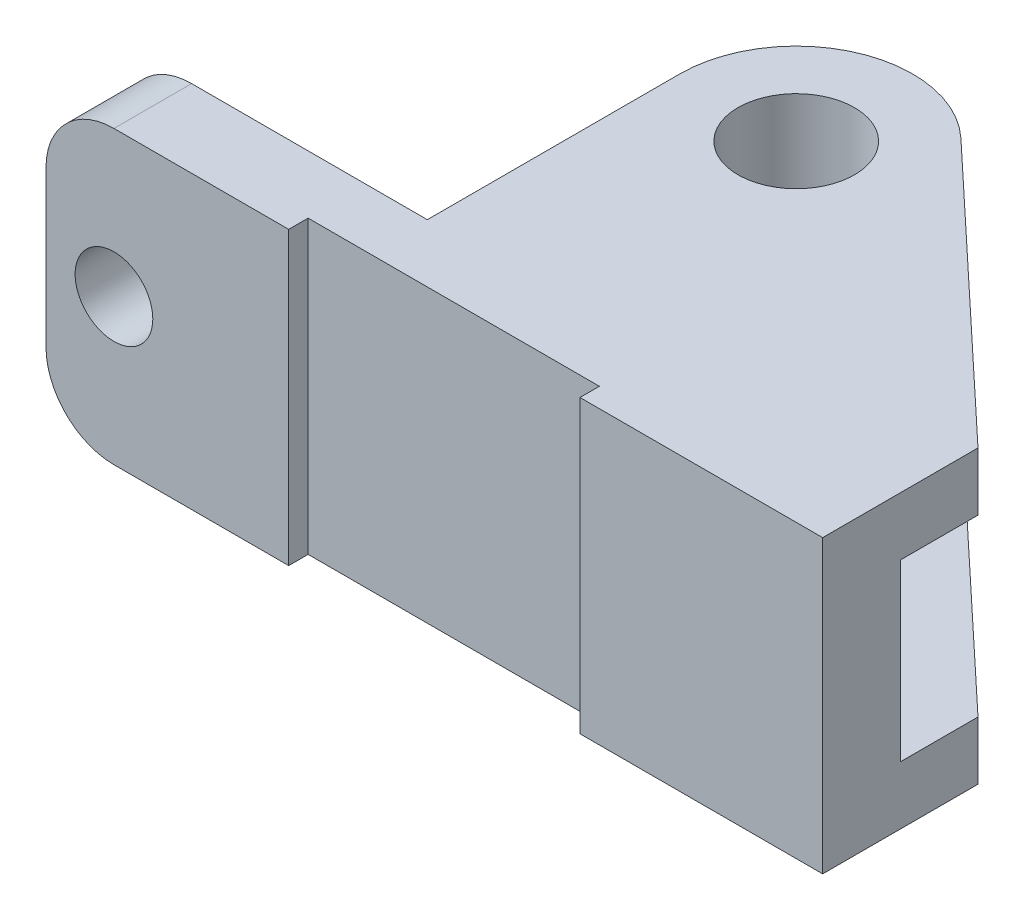
ISO-10303-21;
HEADER;
FILE_DESCRIPTION(('STEP AP214'),'2;1');
FILE_NAME('part.step','',(''),(''),'','','');
FILE_SCHEMA(('AUTOMOTIVE_DESIGN { 1 0 10303 214 1 1 1 1 }'));
ENDSEC;
DATA;
#1=APPLICATION_CONTEXT('core data for automotive mechanical design processes');
#2=APPLICATION_PROTOCOL_DEFINITION('international standard','automotive_design',2000,#1);
#3=PRODUCT_CONTEXT('',#1,'mechanical');
#4=PRODUCT('Part','Part','',(#3));
#5=PRODUCT_RELATED_PRODUCT_CATEGORY('part','',(#4));
#6=PRODUCT_DEFINITION_FORMATION('','',#4);
#7=PRODUCT_DEFINITION_CONTEXT('part definition',#1,'design');
#8=PRODUCT_DEFINITION('design','',#6,#7);
#9=PRODUCT_DEFINITION_SHAPE('','',#8);
#10=(LENGTH_UNIT() NAMED_UNIT(*) SI_UNIT(.MILLI.,.METRE.));
#11=(NAMED_UNIT(*) PLANE_ANGLE_UNIT() SI_UNIT($,.RADIAN.));
#12=(NAMED_UNIT(*) SI_UNIT($,.STERADIAN.) SOLID_ANGLE_UNIT());
#13=UNCERTAINTY_MEASURE_WITH_UNIT(LENGTH_MEASURE(1.E-05),#10,'distance_accuracy_value','');
#14=(GEOMETRIC_REPRESENTATION_CONTEXT(3) GLOBAL_UNCERTAINTY_ASSIGNED_CONTEXT((#13)) GLOBAL_UNIT_ASSIGNED_CONTEXT((#10,
#11,#12)) REPRESENTATION_CONTEXT('',''));
#15=CARTESIAN_POINT('',(0.,0.,0.));
#16=DIRECTION('',(0.,0.,1.));
#17=DIRECTION('',(1.,0.,0.));
#18=AXIS2_PLACEMENT_3D('',#15,#16,#17);
#19=CARTESIAN_POINT('',(-33.,8.,8.));
#20=DIRECTION('',(0.,0.,-1.));
#21=DIRECTION('',(-1.,0.,0.));
#22=AXIS2_PLACEMENT_3D('',#19,#20,#21);
#23=PLANE('',#22);
#24=CARTESIAN_POINT('',(-33.,0.,8.));
#25=DIRECTION('',(0.,0.,1.));
#26=DIRECTION('',(1.,0.,0.));
#27=AXIS2_PLACEMENT_3D('',#24,#25,#26);
#28=CIRCLE('',#27,4.);
#29=CARTESIAN_POINT('',(-29.,0.,8.));
#30=VERTEX_POINT('',#29);
#31=EDGE_CURVE('E242',#30,#30,#28,.T.);
#32=ORIENTED_EDGE('',*,*,#31,.F.);
#33=EDGE_LOOP('',(#32));
#34=FACE_BOUND('',#33,.T.);
#35=DIRECTION('',(1.,0.,0.));
#36=VECTOR('',#35,1.);
#37=CARTESIAN_POINT('',(-33.,-15.,8.));
#38=LINE('',#37,#36);
#39=CARTESIAN_POINT('',(-33.,-15.,8.));
#40=VERTEX_POINT('',#39);
#41=CARTESIAN_POINT('',(-15.,-15.,8.));
#42=VERTEX_POINT('',#41);
#43=EDGE_CURVE('E183',#40,#42,#38,.T.);
#44=ORIENTED_EDGE('',*,*,#43,.T.);
#45=DIRECTION('',(0.,1.,0.));
#46=VECTOR('',#45,1.);
#47=CARTESIAN_POINT('',(-15.,-15.,8.));
#48=LINE('',#47,#46);
#49=CARTESIAN_POINT('',(-15.,15.,8.));
#50=VERTEX_POINT('',#49);
#51=EDGE_CURVE('E166',#42,#50,#48,.T.);
#52=ORIENTED_EDGE('',*,*,#51,.T.);
#53=DIRECTION('',(-1.,0.,0.));
#54=VECTOR('',#53,1.);
#55=CARTESIAN_POINT('',(-33.,15.,8.));
#56=LINE('',#55,#54);
#57=CARTESIAN_POINT('',(-33.,15.,8.));
#58=VERTEX_POINT('',#57);
#59=EDGE_CURVE('E268',#50,#58,#56,.T.);
#60=ORIENTED_EDGE('',*,*,#59,.T.);
#61=CARTESIAN_POINT('',(-33.,8.,8.));
#62=DIRECTION('',(0.,0.,1.));
#63=DIRECTION('',(-1.,0.,0.));
#64=AXIS2_PLACEMENT_3D('',#61,#62,#63);
#65=CIRCLE('',#64,7.);
#66=CARTESIAN_POINT('',(-40.,8.,8.));
#67=VERTEX_POINT('',#66);
#68=EDGE_CURVE('E270',#58,#67,#65,.T.);
#69=ORIENTED_EDGE('',*,*,#68,.T.);
#70=DIRECTION('',(0.,-1.,0.));
#71=VECTOR('',#70,1.);
#72=CARTESIAN_POINT('',(-40.,-8.,8.));
#73=LINE('',#72,#71);
#74=CARTESIAN_POINT('',(-40.,-8.,8.));
#75=VERTEX_POINT('',#74);
#76=EDGE_CURVE('E271',#67,#75,#73,.T.);
#77=ORIENTED_EDGE('',*,*,#76,.T.);
#78=CARTESIAN_POINT('',(-33.,-8.,8.));
#79=DIRECTION('',(0.,0.,1.));
#80=DIRECTION('',(-1.,0.,0.));
#81=AXIS2_PLACEMENT_3D('',#78,#79,#80);
#82=CIRCLE('',#81,7.);
#83=EDGE_CURVE('E188',#75,#40,#82,.T.);
#84=ORIENTED_EDGE('',*,*,#83,.T.);
#85=EDGE_LOOP('',(#44,#52,#60,#69,#77,#84));
#86=FACE_BOUND('',#85,.T.);
#87=ADVANCED_FACE('F41',(#34,#86),#23,.F.);
#88=CARTESIAN_POINT('',(-33.,8.,0.));
#89=DIRECTION('',(0.,0.,-1.));
#90=DIRECTION('',(-1.,0.,0.));
#91=AXIS2_PLACEMENT_3D('',#88,#89,#90);
#92=PLANE('',#91);
#93=CARTESIAN_POINT('',(-33.,0.,0.));
#94=DIRECTION('',(0.,0.,1.));
#95=DIRECTION('',(1.,0.,0.));
#96=AXIS2_PLACEMENT_3D('',#93,#94,#95);
#97=CIRCLE('',#96,4.);
#98=CARTESIAN_POINT('',(-29.,0.,0.));
#99=VERTEX_POINT('',#98);
#100=EDGE_CURVE('E200',#99,#99,#97,.T.);
#101=ORIENTED_EDGE('',*,*,#100,.T.);
#102=EDGE_LOOP('',(#101));
#103=FACE_BOUND('',#102,.T.);
#104=DIRECTION('',(-1.,0.,0.));
#105=VECTOR('',#104,1.);
#106=CARTESIAN_POINT('',(0.,-9.,0.));
#107=LINE('',#106,#105);
#108=CARTESIAN_POINT('',(40.,-9.,0.));
#109=VERTEX_POINT('',#108);
#110=CARTESIAN_POINT('',(-8.72284668201484,-9.,0.));
#111=VERTEX_POINT('',#110);
#112=EDGE_CURVE('E291',#109,#111,#107,.T.);
#113=ORIENTED_EDGE('',*,*,#112,.T.);
#114=DIRECTION('',(0.,-1.,0.));
#115=VECTOR('',#114,1.);
#116=CARTESIAN_POINT('',(-8.72284668201484,-9.,0.));
#117=LINE('',#116,#115);
#118=CARTESIAN_POINT('',(-8.72284668201484,-15.,0.));
#119=VERTEX_POINT('',#118);
#120=EDGE_CURVE('E288',#111,#119,#117,.T.);
#121=ORIENTED_EDGE('',*,*,#120,.T.);
#122=DIRECTION('',(1.,0.,0.));
#123=VECTOR('',#122,1.);
#124=CARTESIAN_POINT('',(-33.,-15.,0.));
#125=LINE('',#124,#123);
#126=CARTESIAN_POINT('',(-33.,-15.,0.));
#127=VERTEX_POINT('',#126);
#128=EDGE_CURVE('E208',#127,#119,#125,.T.);
#129=ORIENTED_EDGE('',*,*,#128,.F.);
#130=CARTESIAN_POINT('',(-33.,-8.,0.));
#131=DIRECTION('',(0.,0.,1.));
#132=DIRECTION('',(-1.,0.,0.));
#133=AXIS2_PLACEMENT_3D('',#130,#131,#132);
#134=CIRCLE('',#133,7.);
#135=CARTESIAN_POINT('',(-40.,-8.,0.));
#136=VERTEX_POINT('',#135);
#137=EDGE_CURVE('E206',#136,#127,#134,.T.);
#138=ORIENTED_EDGE('',*,*,#137,.F.);
#139=DIRECTION('',(0.,-1.,0.));
#140=VECTOR('',#139,1.);
#141=CARTESIAN_POINT('',(-40.,-8.,0.));
#142=LINE('',#141,#140);
#143=CARTESIAN_POINT('',(-40.,8.,0.));
#144=VERTEX_POINT('',#143);
#145=EDGE_CURVE('E204',#144,#136,#142,.T.);
#146=ORIENTED_EDGE('',*,*,#145,.F.);
#147=CARTESIAN_POINT('',(-33.,8.,0.));
#148=DIRECTION('',(0.,0.,1.));
#149=DIRECTION('',(-1.,0.,0.));
#150=AXIS2_PLACEMENT_3D('',#147,#148,#149);
#151=CIRCLE('',#150,7.);
#152=CARTESIAN_POINT('',(-33.,15.,0.));
#153=VERTEX_POINT('',#152);
#154=EDGE_CURVE('E202',#153,#144,#151,.T.);
#155=ORIENTED_EDGE('',*,*,#154,.F.);
#156=DIRECTION('',(-1.,0.,0.));
#157=VECTOR('',#156,1.);
#158=CARTESIAN_POINT('',(-33.,15.,0.));
#159=LINE('',#158,#157);
#160=CARTESIAN_POINT('',(-8.72284668201484,15.,0.));
#161=VERTEX_POINT('',#160);
#162=EDGE_CURVE('E64',#161,#153,#159,.T.);
#163=ORIENTED_EDGE('',*,*,#162,.F.);
#164=DIRECTION('',(0.,1.,0.));
#165=VECTOR('',#164,1.);
#166=CARTESIAN_POINT('',(-8.72284668201484,9.,0.));
#167=LINE('',#166,#165);
#168=CARTESIAN_POINT('',(-8.72284668201484,9.,0.));
#169=VERTEX_POINT('',#168);
#170=EDGE_CURVE('E243',#169,#161,#167,.T.);
#171=ORIENTED_EDGE('',*,*,#170,.F.);
#172=DIRECTION('',(-1.,0.,0.));
#173=VECTOR('',#172,1.);
#174=CARTESIAN_POINT('',(0.,9.,0.));
#175=LINE('',#174,#173);
#176=CARTESIAN_POINT('',(40.,9.,0.));
#177=VERTEX_POINT('',#176);
#178=EDGE_CURVE('E305',#177,#169,#175,.T.);
#179=ORIENTED_EDGE('',*,*,#178,.F.);
#180=DIRECTION('',(0.,1.,0.));
#181=VECTOR('',#180,1.);
#182=CARTESIAN_POINT('',(40.,-15.,0.));
#183=LINE('',#182,#181);
#184=EDGE_CURVE('E198',#109,#177,#183,.T.);
#185=ORIENTED_EDGE('',*,*,#184,.F.);
#186=EDGE_LOOP('',(#113,#121,#129,#138,#146,#155,#163,#171,#179,#185));
#187=FACE_BOUND('',#186,.T.);
#188=ADVANCED_FACE('F286',(#103,#187),#92,.T.);
#189=CARTESIAN_POINT('',(40.,-15.,8.));
#190=DIRECTION('',(-1.,0.,0.));
#191=DIRECTION('',(0.,0.,1.));
#192=AXIS2_PLACEMENT_3D('',#189,#190,#191);
#193=PLANE('',#192);
#194=DIRECTION('',(0.,0.,-1.));
#195=VECTOR('',#194,1.);
#196=CARTESIAN_POINT('',(40.,-15.,8.));
#197=LINE('',#196,#195);
#198=CARTESIAN_POINT('',(40.,-15.,8.));
#199=VERTEX_POINT('',#198);
#200=CARTESIAN_POINT('',(40.,-15.,-8.));
#201=VERTEX_POINT('',#200);
#202=EDGE_CURVE('E190',#199,#201,#197,.T.);
#203=ORIENTED_EDGE('',*,*,#202,.T.);
#204=DIRECTION('',(0.,-1.,0.));
#205=VECTOR('',#204,1.);
#206=CARTESIAN_POINT('',(40.,-9.,-8.));
#207=LINE('',#206,#205);
#208=CARTESIAN_POINT('',(40.,-9.,-8.));
#209=VERTEX_POINT('',#208);
#210=EDGE_CURVE('E294',#209,#201,#207,.T.);
#211=ORIENTED_EDGE('',*,*,#210,.F.);
#212=DIRECTION('',(0.,0.,-1.));
#213=VECTOR('',#212,1.);
#214=CARTESIAN_POINT('',(40.,-9.,0.));
#215=LINE('',#214,#213);
#216=EDGE_CURVE('E335',#109,#209,#215,.T.);
#217=ORIENTED_EDGE('',*,*,#216,.F.);
#218=ORIENTED_EDGE('',*,*,#184,.T.);
#219=DIRECTION('',(0.,0.,-1.));
#220=VECTOR('',#219,1.);
#221=CARTESIAN_POINT('',(40.,9.,0.));
#222=LINE('',#221,#220);
#223=CARTESIAN_POINT('',(40.,9.,-8.));
#224=VERTEX_POINT('',#223);
#225=EDGE_CURVE('E238',#177,#224,#222,.T.);
#226=ORIENTED_EDGE('',*,*,#225,.T.);
#227=DIRECTION('',(0.,1.,0.));
#228=VECTOR('',#227,1.);
#229=CARTESIAN_POINT('',(40.,9.,-8.));
#230=LINE('',#229,#228);
#231=CARTESIAN_POINT('',(40.,15.,-8.));
#232=VERTEX_POINT('',#231);
#233=EDGE_CURVE('E236',#224,#232,#230,.T.);
#234=ORIENTED_EDGE('',*,*,#233,.T.);
#235=DIRECTION('',(0.,0.,-1.));
#236=VECTOR('',#235,1.);
#237=CARTESIAN_POINT('',(40.,15.,8.));
#238=LINE('',#237,#236);
#239=CARTESIAN_POINT('',(40.,15.,8.));
#240=VERTEX_POINT('',#239);
#241=EDGE_CURVE('E49',#240,#232,#238,.T.);
#242=ORIENTED_EDGE('',*,*,#241,.F.);
#243=DIRECTION('',(0.,1.,0.));
#244=VECTOR('',#243,1.);
#245=CARTESIAN_POINT('',(40.,-15.,8.));
#246=LINE('',#245,#244);
#247=EDGE_CURVE('E210',#199,#240,#246,.T.);
#248=ORIENTED_EDGE('',*,*,#247,.F.);
#249=EDGE_LOOP('',(#203,#211,#217,#218,#226,#234,#242,#248));
#250=FACE_BOUND('',#249,.T.);
#251=ADVANCED_FACE('F43',(#250),#193,.F.);
#252=CARTESIAN_POINT('',(-33.,15.,8.));
#253=DIRECTION('',(0.,-1.,0.));
#254=DIRECTION('',(1.,0.,0.));
#255=AXIS2_PLACEMENT_3D('',#252,#253,#254);
#256=PLANE('',#255);
#257=CARTESIAN_POINT('',(3.27715331798516,15.,-26.));
#258=DIRECTION('',(0.,1.,0.));
#259=DIRECTION('',(-1.,0.,0.));
#260=AXIS2_PLACEMENT_3D('',#257,#258,#259);
#261=CIRCLE('',#260,6.);
#262=CARTESIAN_POINT('',(-2.72284668201484,15.,-26.));
#263=VERTEX_POINT('',#262);
#264=EDGE_CURVE('E326',#263,#263,#261,.T.);
#265=ORIENTED_EDGE('',*,*,#264,.F.);
#266=EDGE_LOOP('',(#265));
#267=FACE_BOUND('',#266,.T.);
#268=ORIENTED_EDGE('',*,*,#59,.F.);
#269=DIRECTION('',(0.,0.,1.));
#270=VECTOR('',#269,1.);
#271=CARTESIAN_POINT('',(-15.,15.,8.));
#272=LINE('',#271,#270);
#273=CARTESIAN_POINT('',(-15.,15.,6.));
#274=VERTEX_POINT('',#273);
#275=EDGE_CURVE('E172',#274,#50,#272,.T.);
#276=ORIENTED_EDGE('',*,*,#275,.F.);
#277=DIRECTION('',(-1.,0.,0.));
#278=VECTOR('',#277,1.);
#279=CARTESIAN_POINT('',(-15.,15.,6.));
#280=LINE('',#279,#278);
#281=CARTESIAN_POINT('',(15.,15.,6.));
#282=VERTEX_POINT('',#281);
#283=EDGE_CURVE('E185',#282,#274,#280,.T.);
#284=ORIENTED_EDGE('',*,*,#283,.F.);
#285=DIRECTION('',(0.,0.,-1.));
#286=VECTOR('',#285,1.);
#287=CARTESIAN_POINT('',(15.,15.,8.));
#288=LINE('',#287,#286);
#289=CARTESIAN_POINT('',(15.,15.,8.));
#290=VERTEX_POINT('',#289);
#291=EDGE_CURVE('E366',#290,#282,#288,.T.);
#292=ORIENTED_EDGE('',*,*,#291,.F.);
#293=EDGE_CURVE('E231',#240,#290,#56,.T.);
#294=ORIENTED_EDGE('',*,*,#293,.F.);
#295=ORIENTED_EDGE('',*,*,#241,.T.);
#296=DIRECTION('',(-0.729267686089805,0.,-0.684228501324829));
#297=VECTOR('',#296,1.);
#298=CARTESIAN_POINT('',(22.7186315683517,15.,-24.2140803005124));
#299=LINE('',#298,#297);
#300=CARTESIAN_POINT('',(11.4878953338831,15.,-34.7512122330777));
#301=VERTEX_POINT('',#300);
#302=EDGE_CURVE('E228',#232,#301,#299,.T.);
#303=ORIENTED_EDGE('',*,*,#302,.T.);
#304=CARTESIAN_POINT('',(3.27715331798516,15.,-26.));
#305=DIRECTION('',(0.,1.,0.));
#306=DIRECTION('',(-1.,0.,0.));
#307=AXIS2_PLACEMENT_3D('',#304,#305,#306);
#308=CIRCLE('',#307,12.);
#309=CARTESIAN_POINT('',(-8.72284668201485,15.,-26.));
#310=VERTEX_POINT('',#309);
#311=EDGE_CURVE('E319',#301,#310,#308,.T.);
#312=ORIENTED_EDGE('',*,*,#311,.T.);
#313=DIRECTION('',(0.,0.,1.));
#314=VECTOR('',#313,1.);
#315=CARTESIAN_POINT('',(-8.72284668201484,15.,0.));
#316=LINE('',#315,#314);
#317=EDGE_CURVE('E248',#310,#161,#316,.T.);
#318=ORIENTED_EDGE('',*,*,#317,.T.);
#319=ORIENTED_EDGE('',*,*,#162,.T.);
#320=DIRECTION('',(0.,0.,-1.));
#321=VECTOR('',#320,1.);
#322=CARTESIAN_POINT('',(-33.,15.,8.));
#323=LINE('',#322,#321);
#324=EDGE_CURVE('E219',#58,#153,#323,.T.);
#325=ORIENTED_EDGE('',*,*,#324,.F.);
#326=EDGE_LOOP('',(#268,#276,#284,#292,#294,#295,#303,#312,#318,#319,#325));
#327=FACE_BOUND('',#326,.T.);
#328=ADVANCED_FACE('F225',(#267,#327),#256,.F.);
#329=CARTESIAN_POINT('',(-33.,8.,8.));
#330=DIRECTION('',(0.,0.,-1.));
#331=DIRECTION('',(-1.,0.,0.));
#332=AXIS2_PLACEMENT_3D('',#329,#330,#331);
#333=CYLINDRICAL_SURFACE('',#332,7.);
#334=ORIENTED_EDGE('',*,*,#154,.T.);
#335=DIRECTION('',(0.,0.,-1.));
#336=VECTOR('',#335,1.);
#337=CARTESIAN_POINT('',(-40.,8.,8.));
#338=LINE('',#337,#336);
#339=EDGE_CURVE('E216',#67,#144,#338,.T.);
#340=ORIENTED_EDGE('',*,*,#339,.F.);
#341=ORIENTED_EDGE('',*,*,#68,.F.);
#342=ORIENTED_EDGE('',*,*,#324,.T.);
#343=EDGE_LOOP('',(#334,#340,#341,#342));
#344=FACE_BOUND('',#343,.T.);
#345=ADVANCED_FACE('F411',(#344),#333,.T.);
#346=CARTESIAN_POINT('',(-40.,-8.,8.));
#347=DIRECTION('',(1.,0.,0.));
#348=DIRECTION('',(0.,1.,0.));
#349=AXIS2_PLACEMENT_3D('',#346,#347,#348);
#350=PLANE('',#349);
#351=ORIENTED_EDGE('',*,*,#145,.T.);
#352=DIRECTION('',(0.,0.,-1.));
#353=VECTOR('',#352,1.);
#354=CARTESIAN_POINT('',(-40.,-8.,8.));
#355=LINE('',#354,#353);
#356=EDGE_CURVE('E213',#75,#136,#355,.T.);
#357=ORIENTED_EDGE('',*,*,#356,.F.);
#358=ORIENTED_EDGE('',*,*,#76,.F.);
#359=ORIENTED_EDGE('',*,*,#339,.T.);
#360=EDGE_LOOP('',(#351,#357,#358,#359));
#361=FACE_BOUND('',#360,.T.);
#362=ADVANCED_FACE('F277',(#361),#350,.F.);
#363=CARTESIAN_POINT('',(-33.,-8.,8.));
#364=DIRECTION('',(0.,0.,-1.));
#365=DIRECTION('',(-1.,0.,0.));
#366=AXIS2_PLACEMENT_3D('',#363,#364,#365);
#367=CYLINDRICAL_SURFACE('',#366,7.);
#368=ORIENTED_EDGE('',*,*,#137,.T.);
#369=DIRECTION('',(0.,0.,-1.));
#370=VECTOR('',#369,1.);
#371=CARTESIAN_POINT('',(-33.,-15.,8.));
#372=LINE('',#371,#370);
#373=EDGE_CURVE('E193',#40,#127,#372,.T.);
#374=ORIENTED_EDGE('',*,*,#373,.F.);
#375=ORIENTED_EDGE('',*,*,#83,.F.);
#376=ORIENTED_EDGE('',*,*,#356,.T.);
#377=EDGE_LOOP('',(#368,#374,#375,#376));
#378=FACE_BOUND('',#377,.T.);
#379=ADVANCED_FACE('F281',(#378),#367,.T.);
#380=CARTESIAN_POINT('',(-33.,-15.,8.));
#381=DIRECTION('',(0.,1.,0.));
#382=DIRECTION('',(-1.,0.,0.));
#383=AXIS2_PLACEMENT_3D('',#380,#381,#382);
#384=PLANE('',#383);
#385=CARTESIAN_POINT('',(3.27715331798516,-15.,-26.));
#386=DIRECTION('',(0.,1.,0.));
#387=DIRECTION('',(-1.,0.,0.));
#388=AXIS2_PLACEMENT_3D('',#385,#386,#387);
#389=CIRCLE('',#388,6.);
#390=CARTESIAN_POINT('',(-2.72284668201485,-15.,-26.));
#391=VERTEX_POINT('',#390);
#392=EDGE_CURVE('E322',#391,#391,#389,.T.);
#393=ORIENTED_EDGE('',*,*,#392,.T.);
#394=EDGE_LOOP('',(#393));
#395=FACE_BOUND('',#394,.T.);
#396=DIRECTION('',(-1.,0.,0.));
#397=VECTOR('',#396,1.);
#398=CARTESIAN_POINT('',(-15.,-15.,6.));
#399=LINE('',#398,#397);
#400=CARTESIAN_POINT('',(15.,-15.,6.));
#401=VERTEX_POINT('',#400);
#402=CARTESIAN_POINT('',(-15.,-15.,6.));
#403=VERTEX_POINT('',#402);
#404=EDGE_CURVE('E177',#401,#403,#399,.T.);
#405=ORIENTED_EDGE('',*,*,#404,.T.);
#406=DIRECTION('',(0.,0.,1.));
#407=VECTOR('',#406,1.);
#408=CARTESIAN_POINT('',(-15.,-15.,8.));
#409=LINE('',#408,#407);
#410=EDGE_CURVE('E169',#403,#42,#409,.T.);
#411=ORIENTED_EDGE('',*,*,#410,.T.);
#412=ORIENTED_EDGE('',*,*,#43,.F.);
#413=ORIENTED_EDGE('',*,*,#373,.T.);
#414=ORIENTED_EDGE('',*,*,#128,.T.);
#415=DIRECTION('',(0.,0.,1.));
#416=VECTOR('',#415,1.);
#417=CARTESIAN_POINT('',(-8.72284668201484,-15.,0.));
#418=LINE('',#417,#416);
#419=CARTESIAN_POINT('',(-8.72284668201484,-15.,-26.));
#420=VERTEX_POINT('',#419);
#421=EDGE_CURVE('E336',#420,#119,#418,.T.);
#422=ORIENTED_EDGE('',*,*,#421,.F.);
#423=CARTESIAN_POINT('',(3.27715331798516,-15.,-26.));
#424=DIRECTION('',(0.,1.,0.));
#425=DIRECTION('',(-1.,0.,0.));
#426=AXIS2_PLACEMENT_3D('',#423,#424,#425);
#427=CIRCLE('',#426,12.);
#428=CARTESIAN_POINT('',(11.4878953338831,-15.,-34.7512122330777));
#429=VERTEX_POINT('',#428);
#430=EDGE_CURVE('E321',#429,#420,#427,.T.);
#431=ORIENTED_EDGE('',*,*,#430,.F.);
#432=DIRECTION('',(-0.729267686089805,0.,-0.684228501324829));
#433=VECTOR('',#432,1.);
#434=CARTESIAN_POINT('',(22.7186315683517,-15.,-24.2140803005124));
#435=LINE('',#434,#433);
#436=EDGE_CURVE('E331',#201,#429,#435,.T.);
#437=ORIENTED_EDGE('',*,*,#436,.F.);
#438=ORIENTED_EDGE('',*,*,#202,.F.);
#439=CARTESIAN_POINT('',(15.,-15.,8.));
#440=VERTEX_POINT('',#439);
#441=EDGE_CURVE('E191',#440,#199,#38,.T.);
#442=ORIENTED_EDGE('',*,*,#441,.F.);
#443=DIRECTION('',(0.,0.,-1.));
#444=VECTOR('',#443,1.);
#445=CARTESIAN_POINT('',(15.,-15.,8.));
#446=LINE('',#445,#444);
#447=EDGE_CURVE('E56',#440,#401,#446,.T.);
#448=ORIENTED_EDGE('',*,*,#447,.T.);
#449=EDGE_LOOP('',(#405,#411,#412,#413,#414,#422,#431,#437,#438,#442,#448));
#450=FACE_BOUND('',#449,.T.);
#451=ADVANCED_FACE('F181',(#395,#450),#384,.F.);
#452=ORIENTED_EDGE('',*,*,#293,.T.);
#453=DIRECTION('',(0.,1.,0.));
#454=VECTOR('',#453,1.);
#455=CARTESIAN_POINT('',(15.,-15.,8.));
#456=LINE('',#455,#454);
#457=EDGE_CURVE('E176',#440,#290,#456,.T.);
#458=ORIENTED_EDGE('',*,*,#457,.F.);
#459=ORIENTED_EDGE('',*,*,#441,.T.);
#460=ORIENTED_EDGE('',*,*,#247,.T.);
#461=EDGE_LOOP('',(#452,#458,#459,#460));
#462=FACE_BOUND('',#461,.T.);
#463=ADVANCED_FACE('F353',(#462),#23,.F.);
#464=CARTESIAN_POINT('',(-33.,0.,0.));
#465=DIRECTION('',(0.,0.,1.));
#466=DIRECTION('',(1.,0.,0.));
#467=AXIS2_PLACEMENT_3D('',#464,#465,#466);
#468=CYLINDRICAL_SURFACE('',#467,4.);
#469=ORIENTED_EDGE('',*,*,#100,.F.);
#470=EDGE_LOOP('',(#469));
#471=FACE_BOUND('',#470,.T.);
#472=ORIENTED_EDGE('',*,*,#31,.T.);
#473=EDGE_LOOP('',(#472));
#474=FACE_BOUND('',#473,.T.);
#475=ADVANCED_FACE('F396',(#471,#474),#468,.F.);
#476=CARTESIAN_POINT('',(22.7186315683517,9.,-24.2140803005124));
#477=DIRECTION('',(0.684228501324829,0.,-0.729267686089805));
#478=DIRECTION('',(-0.729267686089805,0.,-0.684228501324829));
#479=AXIS2_PLACEMENT_3D('',#476,#477,#478);
#480=PLANE('',#479);
#481=ORIENTED_EDGE('',*,*,#302,.F.);
#482=ORIENTED_EDGE('',*,*,#233,.F.);
#483=DIRECTION('',(-0.729267686089805,0.,-0.684228501324829));
#484=VECTOR('',#483,1.);
#485=CARTESIAN_POINT('',(22.7186315683517,9.,-24.2140803005124));
#486=LINE('',#485,#484);
#487=CARTESIAN_POINT('',(11.4878953338831,9.,-34.7512122330777));
#488=VERTEX_POINT('',#487);
#489=EDGE_CURVE('E252',#224,#488,#486,.T.);
#490=ORIENTED_EDGE('',*,*,#489,.T.);
#491=DIRECTION('',(0.,1.,0.));
#492=VECTOR('',#491,1.);
#493=CARTESIAN_POINT('',(11.4878953338831,9.,-34.7512122330777));
#494=LINE('',#493,#492);
#495=EDGE_CURVE('E247',#488,#301,#494,.T.);
#496=ORIENTED_EDGE('',*,*,#495,.T.);
#497=EDGE_LOOP('',(#481,#482,#490,#496));
#498=FACE_BOUND('',#497,.T.);
#499=ADVANCED_FACE('F246',(#498),#480,.T.);
#500=CARTESIAN_POINT('',(-8.72284668201484,9.,0.));
#501=DIRECTION('',(-1.,0.,0.));
#502=DIRECTION('',(0.,0.,1.));
#503=AXIS2_PLACEMENT_3D('',#500,#501,#502);
#504=PLANE('',#503);
#505=ORIENTED_EDGE('',*,*,#317,.F.);
#506=DIRECTION('',(0.,1.,0.));
#507=VECTOR('',#506,1.);
#508=CARTESIAN_POINT('',(-8.72284668201484,9.,-26.));
#509=LINE('',#508,#507);
#510=CARTESIAN_POINT('',(-8.72284668201484,9.,-26.));
#511=VERTEX_POINT('',#510);
#512=EDGE_CURVE('E260',#511,#310,#509,.T.);
#513=ORIENTED_EDGE('',*,*,#512,.F.);
#514=DIRECTION('',(0.,0.,1.));
#515=VECTOR('',#514,1.);
#516=CARTESIAN_POINT('',(-8.72284668201484,9.,0.));
#517=LINE('',#516,#515);
#518=EDGE_CURVE('E303',#511,#169,#517,.T.);
#519=ORIENTED_EDGE('',*,*,#518,.T.);
#520=ORIENTED_EDGE('',*,*,#170,.T.);
#521=EDGE_LOOP('',(#505,#513,#519,#520));
#522=FACE_BOUND('',#521,.T.);
#523=ADVANCED_FACE('F315',(#522),#504,.T.);
#524=CARTESIAN_POINT('',(0.,9.,0.));
#525=DIRECTION('',(0.,1.,0.));
#526=DIRECTION('',(-1.,0.,0.));
#527=AXIS2_PLACEMENT_3D('',#524,#525,#526);
#528=PLANE('',#527);
#529=ORIENTED_EDGE('',*,*,#518,.F.);
#530=CARTESIAN_POINT('',(3.27715331798516,9.,-26.));
#531=DIRECTION('',(0.,1.,0.));
#532=DIRECTION('',(-1.,0.,0.));
#533=AXIS2_PLACEMENT_3D('',#530,#531,#532);
#534=CIRCLE('',#533,12.);
#535=EDGE_CURVE('E320',#511,#488,#534,.T.);
#536=ORIENTED_EDGE('',*,*,#535,.T.);
#537=ORIENTED_EDGE('',*,*,#489,.F.);
#538=ORIENTED_EDGE('',*,*,#225,.F.);
#539=ORIENTED_EDGE('',*,*,#178,.T.);
#540=EDGE_LOOP('',(#529,#536,#537,#538,#539));
#541=FACE_BOUND('',#540,.T.);
#542=ADVANCED_FACE('F310',(#541),#528,.F.);
#543=CARTESIAN_POINT('',(22.7186315683517,-9.,-24.2140803005124));
#544=DIRECTION('',(-0.684228501324829,0.,0.729267686089805));
#545=DIRECTION('',(0.729267686089805,0.,0.684228501324829));
#546=AXIS2_PLACEMENT_3D('',#543,#544,#545);
#547=PLANE('',#546);
#548=ORIENTED_EDGE('',*,*,#436,.T.);
#549=DIRECTION('',(0.,-1.,0.));
#550=VECTOR('',#549,1.);
#551=CARTESIAN_POINT('',(11.4878953338831,-9.,-34.7512122330777));
#552=LINE('',#551,#550);
#553=CARTESIAN_POINT('',(11.4878953338831,-9.,-34.7512122330777));
#554=VERTEX_POINT('',#553);
#555=EDGE_CURVE('E249',#554,#429,#552,.T.);
#556=ORIENTED_EDGE('',*,*,#555,.F.);
#557=DIRECTION('',(-0.729267686089805,0.,-0.684228501324829));
#558=VECTOR('',#557,1.);
#559=CARTESIAN_POINT('',(22.7186315683517,-9.,-24.2140803005124));
#560=LINE('',#559,#558);
#561=EDGE_CURVE('E332',#209,#554,#560,.T.);
#562=ORIENTED_EDGE('',*,*,#561,.F.);
#563=ORIENTED_EDGE('',*,*,#210,.T.);
#564=EDGE_LOOP('',(#548,#556,#562,#563));
#565=FACE_BOUND('',#564,.T.);
#566=ADVANCED_FACE('F348',(#565),#547,.F.);
#567=CARTESIAN_POINT('',(-8.72284668201484,-9.,0.));
#568=DIRECTION('',(1.,0.,0.));
#569=DIRECTION('',(0.,0.,-1.));
#570=AXIS2_PLACEMENT_3D('',#567,#568,#569);
#571=PLANE('',#570);
#572=ORIENTED_EDGE('',*,*,#421,.T.);
#573=ORIENTED_EDGE('',*,*,#120,.F.);
#574=DIRECTION('',(0.,0.,1.));
#575=VECTOR('',#574,1.);
#576=CARTESIAN_POINT('',(-8.72284668201484,-9.,0.));
#577=LINE('',#576,#575);
#578=CARTESIAN_POINT('',(-8.72284668201484,-9.,-26.));
#579=VERTEX_POINT('',#578);
#580=EDGE_CURVE('E299',#579,#111,#577,.T.);
#581=ORIENTED_EDGE('',*,*,#580,.F.);
#582=DIRECTION('',(0.,-1.,0.));
#583=VECTOR('',#582,1.);
#584=CARTESIAN_POINT('',(-8.72284668201484,-9.,-26.));
#585=LINE('',#584,#583);
#586=EDGE_CURVE('E254',#579,#420,#585,.T.);
#587=ORIENTED_EDGE('',*,*,#586,.T.);
#588=EDGE_LOOP('',(#572,#573,#581,#587));
#589=FACE_BOUND('',#588,.T.);
#590=ADVANCED_FACE('F342',(#589),#571,.F.);
#591=CARTESIAN_POINT('',(0.,-9.,0.));
#592=DIRECTION('',(0.,-1.,0.));
#593=DIRECTION('',(-1.,0.,0.));
#594=AXIS2_PLACEMENT_3D('',#591,#592,#593);
#595=PLANE('',#594);
#596=ORIENTED_EDGE('',*,*,#561,.T.);
#597=CARTESIAN_POINT('',(3.27715331798516,-9.,-26.));
#598=DIRECTION('',(0.,-1.,0.));
#599=DIRECTION('',(1.,0.,0.));
#600=AXIS2_PLACEMENT_3D('',#597,#598,#599);
#601=CIRCLE('',#600,12.);
#602=EDGE_CURVE('E11',#554,#579,#601,.T.);
#603=ORIENTED_EDGE('',*,*,#602,.T.);
#604=ORIENTED_EDGE('',*,*,#580,.T.);
#605=ORIENTED_EDGE('',*,*,#112,.F.);
#606=ORIENTED_EDGE('',*,*,#216,.T.);
#607=EDGE_LOOP('',(#596,#603,#604,#605,#606));
#608=FACE_BOUND('',#607,.T.);
#609=ADVANCED_FACE('F461',(#608),#595,.F.);
#610=CARTESIAN_POINT('',(3.27715331798516,-15.,-26.));
#611=DIRECTION('',(0.,1.,0.));
#612=DIRECTION('',(-1.,0.,0.));
#613=AXIS2_PLACEMENT_3D('',#610,#611,#612);
#614=CYLINDRICAL_SURFACE('',#613,12.);
#615=ORIENTED_EDGE('',*,*,#535,.F.);
#616=ORIENTED_EDGE('',*,*,#512,.T.);
#617=ORIENTED_EDGE('',*,*,#311,.F.);
#618=ORIENTED_EDGE('',*,*,#495,.F.);
#619=EDGE_LOOP('',(#615,#616,#617,#618));
#620=FACE_BOUND('',#619,.T.);
#621=ORIENTED_EDGE('',*,*,#555,.T.);
#622=ORIENTED_EDGE('',*,*,#430,.T.);
#623=ORIENTED_EDGE('',*,*,#586,.F.);
#624=ORIENTED_EDGE('',*,*,#602,.F.);
#625=EDGE_LOOP('',(#621,#622,#623,#624));
#626=FACE_BOUND('',#625,.T.);
#627=ADVANCED_FACE('F317',(#620,#626),#614,.T.);
#628=CARTESIAN_POINT('',(3.27715331798516,-15.,-26.));
#629=DIRECTION('',(0.,1.,0.));
#630=DIRECTION('',(-1.,0.,0.));
#631=AXIS2_PLACEMENT_3D('',#628,#629,#630);
#632=CYLINDRICAL_SURFACE('',#631,6.);
#633=ORIENTED_EDGE('',*,*,#392,.F.);
#634=EDGE_LOOP('',(#633));
#635=FACE_BOUND('',#634,.T.);
#636=ORIENTED_EDGE('',*,*,#264,.T.);
#637=EDGE_LOOP('',(#636));
#638=FACE_BOUND('',#637,.T.);
#639=ADVANCED_FACE('F381',(#635,#638),#632,.F.);
#640=CARTESIAN_POINT('',(-15.,-15.,8.));
#641=DIRECTION('',(-1.,0.,0.));
#642=DIRECTION('',(0.,-1.,0.));
#643=AXIS2_PLACEMENT_3D('',#640,#641,#642);
#644=PLANE('',#643);
#645=ORIENTED_EDGE('',*,*,#275,.T.);
#646=ORIENTED_EDGE('',*,*,#51,.F.);
#647=ORIENTED_EDGE('',*,*,#410,.F.);
#648=DIRECTION('',(0.,1.,0.));
#649=VECTOR('',#648,1.);
#650=CARTESIAN_POINT('',(-15.,-15.,6.));
#651=LINE('',#650,#649);
#652=EDGE_CURVE('E357',#403,#274,#651,.T.);
#653=ORIENTED_EDGE('',*,*,#652,.T.);
#654=EDGE_LOOP('',(#645,#646,#647,#653));
#655=FACE_BOUND('',#654,.T.);
#656=ADVANCED_FACE('F168',(#655),#644,.F.);
#657=CARTESIAN_POINT('',(-15.,-15.,6.));
#658=DIRECTION('',(0.,0.,-1.));
#659=DIRECTION('',(-1.,0.,0.));
#660=AXIS2_PLACEMENT_3D('',#657,#658,#659);
#661=PLANE('',#660);
#662=ORIENTED_EDGE('',*,*,#283,.T.);
#663=ORIENTED_EDGE('',*,*,#652,.F.);
#664=ORIENTED_EDGE('',*,*,#404,.F.);
#665=DIRECTION('',(0.,1.,0.));
#666=VECTOR('',#665,1.);
#667=CARTESIAN_POINT('',(15.,-15.,6.));
#668=LINE('',#667,#666);
#669=EDGE_CURVE('E355',#401,#282,#668,.T.);
#670=ORIENTED_EDGE('',*,*,#669,.T.);
#671=EDGE_LOOP('',(#662,#663,#664,#670));
#672=FACE_BOUND('',#671,.T.);
#673=ADVANCED_FACE('F373',(#672),#661,.F.);
#674=CARTESIAN_POINT('',(15.,-15.,8.));
#675=DIRECTION('',(1.,0.,0.));
#676=DIRECTION('',(0.,1.,0.));
#677=AXIS2_PLACEMENT_3D('',#674,#675,#676);
#678=PLANE('',#677);
#679=ORIENTED_EDGE('',*,*,#291,.T.);
#680=ORIENTED_EDGE('',*,*,#669,.F.);
#681=ORIENTED_EDGE('',*,*,#447,.F.);
#682=ORIENTED_EDGE('',*,*,#457,.T.);
#683=EDGE_LOOP('',(#679,#680,#681,#682));
#684=FACE_BOUND('',#683,.T.);
#685=ADVANCED_FACE('F371',(#684),#678,.F.);
#686=CLOSED_SHELL('',(#87,#188,#251,#328,#345,#362,#379,#451,#463,#475,#499,#523,#542,#566,#590,
#609,#627,#639,#656,#673,#685));
#687=MANIFOLD_SOLID_BREP('B2',#686);
#688=ADVANCED_BREP_SHAPE_REPRESENTATION('',(#18,#687),#14);
#689=SHAPE_DEFINITION_REPRESENTATION(#9,#688);
ENDSEC;
END-ISO-10303-21;
